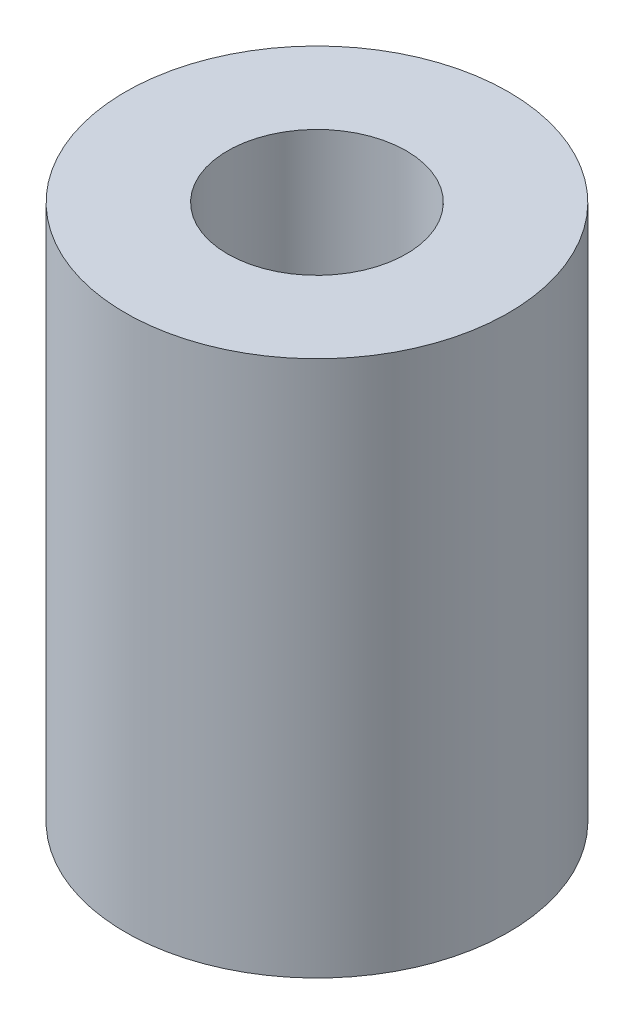
ISO-10303-21;
HEADER;
FILE_DESCRIPTION(('STEP AP214'),'2;1');
FILE_NAME('part.step','',(''),(''),'','','');
FILE_SCHEMA(('AUTOMOTIVE_DESIGN { 1 0 10303 214 1 1 1 1 }'));
ENDSEC;
DATA;
#1=APPLICATION_CONTEXT('core data for automotive mechanical design processes');
#2=APPLICATION_PROTOCOL_DEFINITION('international standard','automotive_design',2000,#1);
#3=PRODUCT_CONTEXT('',#1,'mechanical');
#4=PRODUCT('Part','Part','',(#3));
#5=PRODUCT_RELATED_PRODUCT_CATEGORY('part','',(#4));
#6=PRODUCT_DEFINITION_FORMATION('','',#4);
#7=PRODUCT_DEFINITION_CONTEXT('part definition',#1,'design');
#8=PRODUCT_DEFINITION('design','',#6,#7);
#9=PRODUCT_DEFINITION_SHAPE('','',#8);
#10=(LENGTH_UNIT() NAMED_UNIT(*) SI_UNIT(.MILLI.,.METRE.));
#11=(NAMED_UNIT(*) PLANE_ANGLE_UNIT() SI_UNIT($,.RADIAN.));
#12=(NAMED_UNIT(*) SI_UNIT($,.STERADIAN.) SOLID_ANGLE_UNIT());
#13=UNCERTAINTY_MEASURE_WITH_UNIT(LENGTH_MEASURE(1.E-05),#10,'distance_accuracy_value','');
#14=(GEOMETRIC_REPRESENTATION_CONTEXT(3) GLOBAL_UNCERTAINTY_ASSIGNED_CONTEXT((#13)) GLOBAL_UNIT_ASSIGNED_CONTEXT((#10,
#11,#12)) REPRESENTATION_CONTEXT('',''));
#15=CARTESIAN_POINT('',(0.,0.,0.));
#16=DIRECTION('',(0.,0.,1.));
#17=DIRECTION('',(1.,0.,0.));
#18=AXIS2_PLACEMENT_3D('',#15,#16,#17);
#19=CARTESIAN_POINT('',(0.,10.5,0.));
#20=DIRECTION('',(0.,-1.,0.));
#21=DIRECTION('',(0.,0.,-1.));
#22=AXIS2_PLACEMENT_3D('',#19,#20,#21);
#23=CYLINDRICAL_SURFACE('',#22,3.75);
#24=CARTESIAN_POINT('',(0.,10.5,0.));
#25=DIRECTION('',(0.,1.,0.));
#26=DIRECTION('',(0.,0.,1.));
#27=AXIS2_PLACEMENT_3D('',#24,#25,#26);
#28=CIRCLE('',#27,3.75);
#29=CARTESIAN_POINT('',(0.,10.5,-3.75));
#30=VERTEX_POINT('',#29);
#31=EDGE_CURVE('E10',#30,#30,#28,.T.);
#32=CARTESIAN_POINT('',(0.,0.,0.));
#33=DIRECTION('',(0.,1.,0.));
#34=DIRECTION('',(0.,0.,1.));
#35=AXIS2_PLACEMENT_3D('',#32,#33,#34);
#36=CIRCLE('',#35,3.75);
#37=CARTESIAN_POINT('',(0.,0.,-3.75));
#38=VERTEX_POINT('',#37);
#39=EDGE_CURVE('E38',#38,#38,#36,.T.);
#40=CARTESIAN_POINT('',(0.,10.5,-3.75));
#41=CARTESIAN_POINT('',(0.,10.390625,-3.75));
#42=CARTESIAN_POINT('',(0.,10.28125,-3.75));
#43=CARTESIAN_POINT('',(0.,10.0625,-3.75));
#44=CARTESIAN_POINT('',(0.,9.953125,-3.75));
#45=CARTESIAN_POINT('',(0.,9.734375,-3.75));
#46=CARTESIAN_POINT('',(0.,9.625,-3.75));
#47=CARTESIAN_POINT('',(0.,9.40625,-3.75));
#48=CARTESIAN_POINT('',(0.,9.296875,-3.75));
#49=CARTESIAN_POINT('',(0.,9.078125,-3.75));
#50=CARTESIAN_POINT('',(0.,8.96875,-3.75));
#51=CARTESIAN_POINT('',(0.,8.75,-3.75));
#52=CARTESIAN_POINT('',(0.,8.640625,-3.75));
#53=CARTESIAN_POINT('',(0.,8.421875,-3.75));
#54=CARTESIAN_POINT('',(0.,8.3125,-3.75));
#55=CARTESIAN_POINT('',(0.,8.09375,-3.75));
#56=CARTESIAN_POINT('',(0.,7.984375,-3.75));
#57=CARTESIAN_POINT('',(0.,7.765625,-3.75));
#58=CARTESIAN_POINT('',(0.,7.65625,-3.75));
#59=CARTESIAN_POINT('',(0.,7.4375,-3.75));
#60=CARTESIAN_POINT('',(0.,7.328125,-3.75));
#61=CARTESIAN_POINT('',(0.,7.109375,-3.75));
#62=CARTESIAN_POINT('',(0.,7.,-3.75));
#63=CARTESIAN_POINT('',(0.,6.78125,-3.75));
#64=CARTESIAN_POINT('',(0.,6.671875,-3.75));
#65=CARTESIAN_POINT('',(0.,6.453125,-3.75));
#66=CARTESIAN_POINT('',(0.,6.34375,-3.75));
#67=CARTESIAN_POINT('',(0.,6.125,-3.75));
#68=CARTESIAN_POINT('',(0.,6.015625,-3.75));
#69=CARTESIAN_POINT('',(0.,5.796875,-3.75));
#70=CARTESIAN_POINT('',(0.,5.6875,-3.75));
#71=CARTESIAN_POINT('',(0.,5.46875,-3.75));
#72=CARTESIAN_POINT('',(0.,5.359375,-3.75));
#73=CARTESIAN_POINT('',(0.,5.140625,-3.75));
#74=CARTESIAN_POINT('',(0.,5.03125,-3.75));
#75=CARTESIAN_POINT('',(0.,4.8125,-3.75));
#76=CARTESIAN_POINT('',(0.,4.703125,-3.75));
#77=CARTESIAN_POINT('',(0.,4.484375,-3.75));
#78=CARTESIAN_POINT('',(0.,4.375,-3.75));
#79=CARTESIAN_POINT('',(0.,4.15625,-3.75));
#80=CARTESIAN_POINT('',(0.,4.046875,-3.75));
#81=CARTESIAN_POINT('',(0.,3.828125,-3.75));
#82=CARTESIAN_POINT('',(0.,3.71875,-3.75));
#83=CARTESIAN_POINT('',(0.,3.5,-3.75));
#84=CARTESIAN_POINT('',(0.,3.390625,-3.75));
#85=CARTESIAN_POINT('',(0.,3.171875,-3.75));
#86=CARTESIAN_POINT('',(0.,3.0625,-3.75));
#87=CARTESIAN_POINT('',(0.,2.84375,-3.75));
#88=CARTESIAN_POINT('',(0.,2.734375,-3.75));
#89=CARTESIAN_POINT('',(0.,2.515625,-3.75));
#90=CARTESIAN_POINT('',(0.,2.40625,-3.75));
#91=CARTESIAN_POINT('',(0.,2.1875,-3.75));
#92=CARTESIAN_POINT('',(0.,2.078125,-3.75));
#93=CARTESIAN_POINT('',(0.,1.859375,-3.75));
#94=CARTESIAN_POINT('',(0.,1.75,-3.75));
#95=CARTESIAN_POINT('',(0.,1.53125,-3.75));
#96=CARTESIAN_POINT('',(0.,1.421875,-3.75));
#97=CARTESIAN_POINT('',(0.,1.203125,-3.75));
#98=CARTESIAN_POINT('',(0.,1.09375,-3.75));
#99=CARTESIAN_POINT('',(0.,0.875000000000001,-3.75));
#100=CARTESIAN_POINT('',(0.,0.765625000000001,-3.75));
#101=CARTESIAN_POINT('',(0.,0.546875,-3.75));
#102=CARTESIAN_POINT('',(0.,0.4375,-3.75));
#103=CARTESIAN_POINT('',(0.,0.21875,-3.75));
#104=CARTESIAN_POINT('',(0.,0.109375,-3.75));
#105=CARTESIAN_POINT('',(0.,0.,-3.75));
#106=B_SPLINE_CURVE_WITH_KNOTS('',3,(#40,#41,#42,#43,#44,#45,#46,#47,#48,#49,#50,#51,#52,#53,
#54,#55,#56,#57,#58,#59,#60,#61,#62,#63,#64,#65,#66,#67,#68,#69,#70,#71,#72,#73,#74,#75,#76,#77,
#78,#79,#80,#81,#82,#83,#84,#85,#86,#87,#88,#89,#90,#91,#92,#93,#94,#95,#96,#97,#98,#99,#100,
#101,#102,#103,#104,#105),.UNSPECIFIED.,.F.,.F.,(4,2,2,2,2,2,2,2,2,2,2,2,2,2,2,2,2,2,2,2,2,2,2,
2,2,2,2,2,2,2,2,2,4),(0.,0.328124999999999,0.656249999999999,0.984374999999999,1.3125,1.640625,
1.96875,2.296875,2.625,2.953125,3.28125,3.609375,3.9375,4.265625,4.59375,4.921875,5.25,5.578125,
5.90625,6.234375,6.5625,6.890625,7.21875,7.546875,7.875,8.203125,8.53125,8.859375,9.1875,
9.515625,9.84375,10.171875,10.5),.UNSPECIFIED.);
#107=EDGE_CURVE('BSEAM35',#30,#38,#106,.T.);
#108=ORIENTED_EDGE('',*,*,#31,.F.);
#109=ORIENTED_EDGE('',*,*,#39,.T.);
#110=ORIENTED_EDGE('',*,*,#107,.T.);
#111=ORIENTED_EDGE('',*,*,#107,.F.);
#112=EDGE_LOOP('',(#108,#110,#109,#111));
#113=FACE_BOUND('',#112,.T.);
#114=ADVANCED_FACE('F35',(#113),#23,.T.);
#115=CARTESIAN_POINT('',(0.,10.5,0.));
#116=DIRECTION('',(0.,1.,0.));
#117=DIRECTION('',(0.,0.,1.));
#118=AXIS2_PLACEMENT_3D('',#115,#116,#117);
#119=PLANE('',#118);
#120=CARTESIAN_POINT('',(0.,10.5,0.));
#121=DIRECTION('',(0.,1.,0.));
#122=DIRECTION('',(0.,0.,1.));
#123=AXIS2_PLACEMENT_3D('',#120,#121,#122);
#124=CIRCLE('',#123,1.75);
#125=CARTESIAN_POINT('',(0.,10.5,1.75));
#126=VERTEX_POINT('',#125);
#127=EDGE_CURVE('E49',#126,#126,#124,.T.);
#128=ORIENTED_EDGE('',*,*,#127,.F.);
#129=EDGE_LOOP('',(#128));
#130=FACE_BOUND('',#129,.T.);
#131=ORIENTED_EDGE('',*,*,#31,.T.);
#132=EDGE_LOOP('',(#131));
#133=FACE_BOUND('',#132,.T.);
#134=ADVANCED_FACE('F55',(#130,#133),#119,.T.);
#135=CARTESIAN_POINT('',(0.,0.,0.));
#136=DIRECTION('',(0.,1.,0.));
#137=DIRECTION('',(0.,0.,1.));
#138=AXIS2_PLACEMENT_3D('',#135,#136,#137);
#139=PLANE('',#138);
#140=CARTESIAN_POINT('',(0.,0.,0.));
#141=DIRECTION('',(0.,1.,0.));
#142=DIRECTION('',(0.,0.,1.));
#143=AXIS2_PLACEMENT_3D('',#140,#141,#142);
#144=CIRCLE('',#143,1.75);
#145=CARTESIAN_POINT('',(0.,0.,1.75));
#146=VERTEX_POINT('',#145);
#147=EDGE_CURVE('E45',#146,#146,#144,.T.);
#148=ORIENTED_EDGE('',*,*,#147,.T.);
#149=EDGE_LOOP('',(#148));
#150=FACE_BOUND('',#149,.T.);
#151=ORIENTED_EDGE('',*,*,#39,.F.);
#152=EDGE_LOOP('',(#151));
#153=FACE_BOUND('',#152,.T.);
#154=ADVANCED_FACE('F57',(#150,#153),#139,.F.);
#155=CARTESIAN_POINT('',(0.,10.5,0.));
#156=DIRECTION('',(0.,1.,0.));
#157=DIRECTION('',(0.,0.,1.));
#158=AXIS2_PLACEMENT_3D('',#155,#156,#157);
#159=CYLINDRICAL_SURFACE('',#158,1.75);
#160=ORIENTED_EDGE('',*,*,#147,.F.);
#161=EDGE_LOOP('',(#160));
#162=FACE_BOUND('',#161,.T.);
#163=ORIENTED_EDGE('',*,*,#127,.T.);
#164=EDGE_LOOP('',(#163));
#165=FACE_BOUND('',#164,.T.);
#166=ADVANCED_FACE('F53',(#162,#165),#159,.F.);
#167=CLOSED_SHELL('',(#114,#134,#154,#166));
#168=MANIFOLD_SOLID_BREP('B2',#167);
#169=ADVANCED_BREP_SHAPE_REPRESENTATION('',(#18,#168),#14);
#170=SHAPE_DEFINITION_REPRESENTATION(#9,#169);
ENDSEC;
END-ISO-10303-21;
